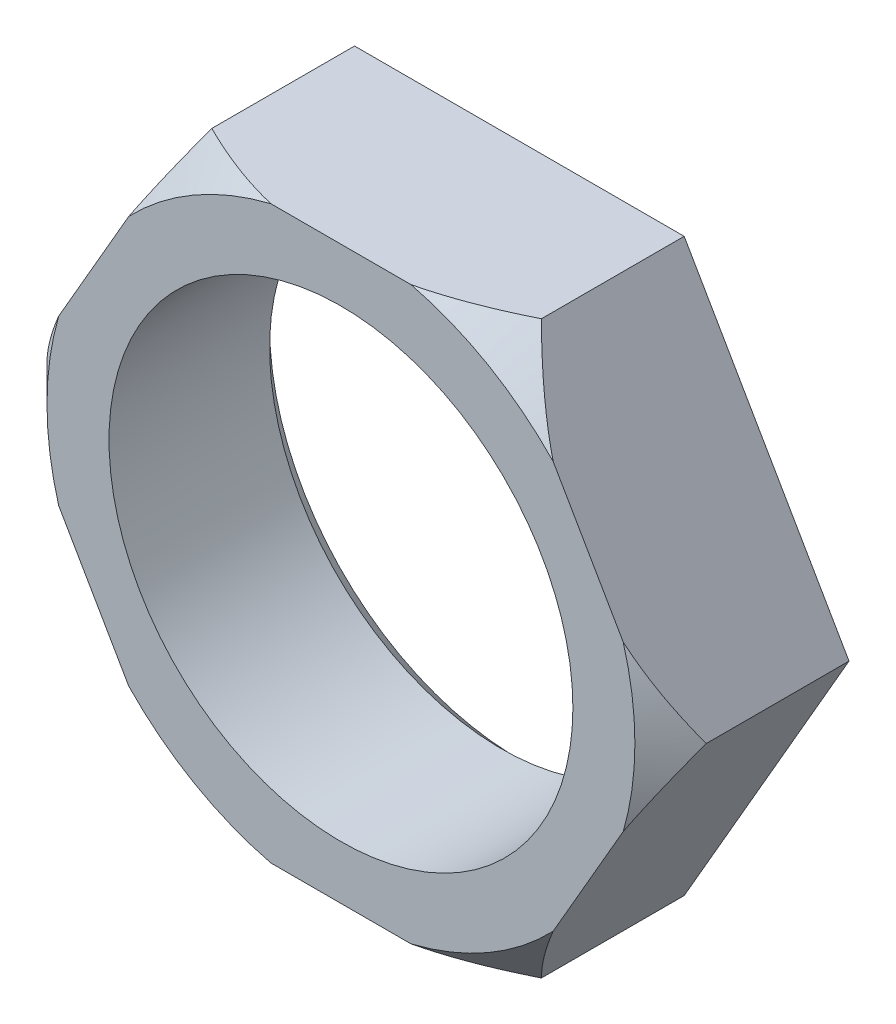
ISO-10303-21;
HEADER;
FILE_DESCRIPTION(('STEP AP214'),'2;1');
FILE_NAME('part.step','',(''),(''),'','','');
FILE_SCHEMA(('AUTOMOTIVE_DESIGN { 1 0 10303 214 1 1 1 1 }'));
ENDSEC;
DATA;
#1=APPLICATION_CONTEXT('core data for automotive mechanical design processes');
#2=APPLICATION_PROTOCOL_DEFINITION('international standard','automotive_design',2000,#1);
#3=PRODUCT_CONTEXT('',#1,'mechanical');
#4=PRODUCT('Part','Part','',(#3));
#5=PRODUCT_RELATED_PRODUCT_CATEGORY('part','',(#4));
#6=PRODUCT_DEFINITION_FORMATION('','',#4);
#7=PRODUCT_DEFINITION_CONTEXT('part definition',#1,'design');
#8=PRODUCT_DEFINITION('design','',#6,#7);
#9=PRODUCT_DEFINITION_SHAPE('','',#8);
#10=(LENGTH_UNIT() NAMED_UNIT(*) SI_UNIT(.MILLI.,.METRE.));
#11=(NAMED_UNIT(*) PLANE_ANGLE_UNIT() SI_UNIT($,.RADIAN.));
#12=(NAMED_UNIT(*) SI_UNIT($,.STERADIAN.) SOLID_ANGLE_UNIT());
#13=UNCERTAINTY_MEASURE_WITH_UNIT(LENGTH_MEASURE(1.E-05),#10,'distance_accuracy_value','');
#14=(GEOMETRIC_REPRESENTATION_CONTEXT(3) GLOBAL_UNCERTAINTY_ASSIGNED_CONTEXT((#13)) GLOBAL_UNIT_ASSIGNED_CONTEXT((#10,
#11,#12)) REPRESENTATION_CONTEXT('',''));
#15=CARTESIAN_POINT('',(0.,0.,0.));
#16=DIRECTION('',(0.,0.,1.));
#17=DIRECTION('',(1.,0.,0.));
#18=AXIS2_PLACEMENT_3D('',#15,#16,#17);
#19=CARTESIAN_POINT('',(0.,0.,5.));
#20=DIRECTION('',(0.,0.,1.));
#21=DIRECTION('',(1.,0.,0.));
#22=AXIS2_PLACEMENT_3D('',#19,#20,#21);
#23=PLANE('',#22);
#24=CARTESIAN_POINT('',(0.,0.,5.));
#25=DIRECTION('',(0.,0.,1.));
#26=DIRECTION('',(1.,0.,0.));
#27=AXIS2_PLACEMENT_3D('',#24,#25,#26);
#28=CIRCLE('',#27,6.5);
#29=CARTESIAN_POINT('',(6.5,0.,5.));
#30=VERTEX_POINT('',#29);
#31=EDGE_CURVE('E180',#30,#30,#28,.T.);
#32=ORIENTED_EDGE('',*,*,#31,.F.);
#33=EDGE_LOOP('',(#32));
#34=FACE_BOUND('',#33,.T.);
#35=DIRECTION('',(-0.5,0.866025403784438,0.));
#36=VECTOR('',#35,1.);
#37=CARTESIAN_POINT('',(9.23760430703402,0.,5.));
#38=LINE('',#37,#36);
#39=CARTESIAN_POINT('',(7.91030871331505,2.29894340498354,5.));
#40=VERTEX_POINT('',#39);
#41=CARTESIAN_POINT('',(5.94609774723597,5.70105659501646,5.));
#42=VERTEX_POINT('',#41);
#43=EDGE_CURVE('E169',#40,#42,#38,.T.);
#44=ORIENTED_EDGE('',*,*,#43,.T.);
#45=CARTESIAN_POINT('',(0.,0.,5.));
#46=DIRECTION('',(0.,0.,-1.));
#47=DIRECTION('',(-1.,0.,0.));
#48=AXIS2_PLACEMENT_3D('',#45,#46,#47);
#49=CIRCLE('',#48,8.23760430703402);
#50=CARTESIAN_POINT('',(1.9642109660791,8.,5.));
#51=VERTEX_POINT('',#50);
#52=EDGE_CURVE('E303',#51,#42,#49,.T.);
#53=ORIENTED_EDGE('',*,*,#52,.F.);
#54=DIRECTION('',(-1.,0.,0.));
#55=VECTOR('',#54,1.);
#56=CARTESIAN_POINT('',(4.618802153517,8.,5.));
#57=LINE('',#56,#55);
#58=CARTESIAN_POINT('',(-1.9642109660791,8.,5.));
#59=VERTEX_POINT('',#58);
#60=EDGE_CURVE('E165',#51,#59,#57,.T.);
#61=ORIENTED_EDGE('',*,*,#60,.T.);
#62=CARTESIAN_POINT('',(-5.94609774723597,5.70105659501647,4.99999999999999));
#63=VERTEX_POINT('',#62);
#64=EDGE_CURVE('E150',#63,#59,#49,.T.);
#65=ORIENTED_EDGE('',*,*,#64,.F.);
#66=DIRECTION('',(-0.5,-0.866025403784439,0.));
#67=VECTOR('',#66,1.);
#68=CARTESIAN_POINT('',(-4.61880215351701,8.,5.));
#69=LINE('',#68,#67);
#70=CARTESIAN_POINT('',(-7.91030871331506,2.29894340498353,4.99999999999999));
#71=VERTEX_POINT('',#70);
#72=EDGE_CURVE('E156',#63,#71,#69,.T.);
#73=ORIENTED_EDGE('',*,*,#72,.T.);
#74=CARTESIAN_POINT('',(-7.91030871331506,-2.29894340498353,4.99999999999999));
#75=VERTEX_POINT('',#74);
#76=EDGE_CURVE('E138',#75,#71,#49,.T.);
#77=ORIENTED_EDGE('',*,*,#76,.F.);
#78=DIRECTION('',(0.5,-0.866025403784439,0.));
#79=VECTOR('',#78,1.);
#80=CARTESIAN_POINT('',(-9.23760430703402,0.,5.));
#81=LINE('',#80,#79);
#82=CARTESIAN_POINT('',(-5.94609774723596,-5.70105659501648,4.99999999999999));
#83=VERTEX_POINT('',#82);
#84=EDGE_CURVE('E164',#75,#83,#81,.T.);
#85=ORIENTED_EDGE('',*,*,#84,.T.);
#86=CARTESIAN_POINT('',(-1.9642109660791,-8.,5.));
#87=VERTEX_POINT('',#86);
#88=EDGE_CURVE('E148',#87,#83,#49,.T.);
#89=ORIENTED_EDGE('',*,*,#88,.F.);
#90=DIRECTION('',(1.,0.,0.));
#91=VECTOR('',#90,1.);
#92=CARTESIAN_POINT('',(-4.61880215351701,-8.,5.));
#93=LINE('',#92,#91);
#94=CARTESIAN_POINT('',(1.96421096607908,-8.,5.));
#95=VERTEX_POINT('',#94);
#96=EDGE_CURVE('E167',#87,#95,#93,.T.);
#97=ORIENTED_EDGE('',*,*,#96,.T.);
#98=CARTESIAN_POINT('',(5.94609774723597,-5.70105659501646,5.));
#99=VERTEX_POINT('',#98);
#100=EDGE_CURVE('E333',#99,#95,#49,.T.);
#101=ORIENTED_EDGE('',*,*,#100,.F.);
#102=DIRECTION('',(0.5,0.866025403784439,0.));
#103=VECTOR('',#102,1.);
#104=CARTESIAN_POINT('',(4.61880215351701,-8.,5.));
#105=LINE('',#104,#103);
#106=CARTESIAN_POINT('',(7.91030871331505,-2.29894340498354,5.));
#107=VERTEX_POINT('',#106);
#108=EDGE_CURVE('E194',#99,#107,#105,.T.);
#109=ORIENTED_EDGE('',*,*,#108,.T.);
#110=EDGE_CURVE('E305',#40,#107,#49,.T.);
#111=ORIENTED_EDGE('',*,*,#110,.F.);
#112=EDGE_LOOP('',(#44,#53,#61,#65,#73,#77,#85,#89,#97,#101,#109,#111));
#113=FACE_BOUND('',#112,.T.);
#114=ADVANCED_FACE('F49',(#34,#113),#23,.T.);
#115=CARTESIAN_POINT('',(4.61880215351701,-8.,5.));
#116=DIRECTION('',(-0.866025403784439,0.5,0.));
#117=DIRECTION('',(-0.5,-0.866025403784439,0.));
#118=AXIS2_PLACEMENT_3D('',#115,#116,#117);
#119=PLANE('',#118);
#120=CARTESIAN_POINT('',(4.61839800832857,-8.0007,3.9995958282907));
#121=CARTESIAN_POINT('',(4.69782286430401,-7.86313211406671,4.07901918181854));
#122=CARTESIAN_POINT('',(4.77785825491992,-7.72450675111634,4.1560054071897));
#123=CARTESIAN_POINT('',(4.93926992045058,-7.44493354548292,4.30436213535415));
#124=CARTESIAN_POINT('',(5.0206468989046,-7.30398448423411,4.37572957048532));
#125=CARTESIAN_POINT('',(5.26772621714585,-6.87603055154078,4.58090030598886));
#126=CARTESIAN_POINT('',(5.4355204279216,-6.58540245326127,4.70489649185222));
#127=CARTESIAN_POINT('',(5.77389105134235,-5.99932734170777,4.91723258665979));
#128=CARTESIAN_POINT('',(5.94438094347211,-5.70403018636209,5.0061075492822));
#129=CARTESIAN_POINT('',(6.2029192460461,-5.25622871060133,5.10891492448876));
#130=CARTESIAN_POINT('',(6.28947937833778,-5.10630216356224,5.13808611718849));
#131=CARTESIAN_POINT('',(6.46333271999396,-4.80517934274812,5.18559990423727));
#132=CARTESIAN_POINT('',(6.5506258177712,-4.65398326224785,5.20394411763072));
#133=CARTESIAN_POINT('',(6.76333420874638,-4.28556152188262,5.2346994393306));
#134=CARTESIAN_POINT('',(6.8889786631582,-4.06793894315208,5.24115403201832));
#135=CARTESIAN_POINT('',(7.14004125523187,-3.63308577780053,5.23033059090234));
#136=CARTESIAN_POINT('',(7.26545929811714,-3.41585535533741,5.21304423672713));
#137=CARTESIAN_POINT('',(7.51511311464681,-2.98344226080454,5.15575786712185));
#138=CARTESIAN_POINT('',(7.63934740728517,-2.76826215391251,5.11573244120219));
#139=CARTESIAN_POINT('',(7.88568076089192,-2.3416002698668,5.01514401708641));
#140=CARTESIAN_POINT('',(8.00777998478796,-2.13011821051412,4.95458259325327));
#141=CARTESIAN_POINT('',(8.22455299532494,-1.75465634255442,4.82997392329796));
#142=CARTESIAN_POINT('',(8.31970629502342,-1.58984599296882,4.76920070424597));
#143=CARTESIAN_POINT('',(8.50830433629054,-1.26318460328621,4.63785846738779));
#144=CARTESIAN_POINT('',(8.60174902543571,-1.10133365398928,4.56728914958733));
#145=CARTESIAN_POINT('',(8.7866355717818,-0.781100762081904,4.41793724064377));
#146=CARTESIAN_POINT('',(8.87808268778483,-0.622709710959015,4.33918047381096));
#147=CARTESIAN_POINT('',(9.0592831083441,-0.308861376197516,4.17448822158527));
#148=CARTESIAN_POINT('',(9.14903741198672,-0.153402362090536,4.08855714400516));
#149=CARTESIAN_POINT('',(9.23800845222245,0.000699999999999628,3.9995958282907));
#150=B_SPLINE_CURVE_WITH_KNOTS('',3,(#120,#121,#122,#123,#124,#125,#126,#127,#128,#129,#130,
#131,#132,#133,#134,#135,#136,#137,#138,#139,#140,#141,#142,#143,#144,#145,#146,#147,#148,#149),
.UNSPECIFIED.,.F.,.F.,(4,2,2,2,2,2,2,2,2,2,2,2,2,2,4),(0.,0.532764942298107,1.06581876702747,
2.13768333961069,3.19252330094283,3.71890840723074,4.24521477900717,4.99815844168652,
5.75136605213299,6.5054170183609,7.25941018941171,7.85845333924238,8.45751483813045,
9.05474106693446,9.65160302968535),.UNSPECIFIED.);
#151=CARTESIAN_POINT('',(4.61880215351701,-8.,4.));
#152=VERTEX_POINT('',#151);
#153=EDGE_CURVE('E231',#152,#99,#150,.T.);
#154=ORIENTED_EDGE('',*,*,#153,.F.);
#155=DIRECTION('',(0.,0.,-1.));
#156=VECTOR('',#155,1.);
#157=CARTESIAN_POINT('',(4.61880215351701,-8.,5.));
#158=LINE('',#157,#156);
#159=CARTESIAN_POINT('',(4.61880215351701,-8.,0.));
#160=VERTEX_POINT('',#159);
#161=EDGE_CURVE('E175',#152,#160,#158,.T.);
#162=ORIENTED_EDGE('',*,*,#161,.T.);
#163=DIRECTION('',(0.5,0.866025403784439,0.));
#164=VECTOR('',#163,1.);
#165=CARTESIAN_POINT('',(4.61880215351701,-8.,0.));
#166=LINE('',#165,#164);
#167=CARTESIAN_POINT('',(9.23760430703402,0.,0.));
#168=VERTEX_POINT('',#167);
#169=EDGE_CURVE('E176',#160,#168,#166,.T.);
#170=ORIENTED_EDGE('',*,*,#169,.T.);
#171=DIRECTION('',(0.,0.,-1.));
#172=VECTOR('',#171,1.);
#173=CARTESIAN_POINT('',(9.23760430703402,0.,5.));
#174=LINE('',#173,#172);
#175=CARTESIAN_POINT('',(9.23760430703402,0.,4.));
#176=VERTEX_POINT('',#175);
#177=EDGE_CURVE('E203',#176,#168,#174,.T.);
#178=ORIENTED_EDGE('',*,*,#177,.F.);
#179=EDGE_CURVE('E65',#107,#176,#150,.T.);
#180=ORIENTED_EDGE('',*,*,#179,.F.);
#181=ORIENTED_EDGE('',*,*,#108,.F.);
#182=EDGE_LOOP('',(#154,#162,#170,#178,#180,#181));
#183=FACE_BOUND('',#182,.T.);
#184=ADVANCED_FACE('F270',(#183),#119,.F.);
#185=CARTESIAN_POINT('',(9.23760430703402,0.,5.));
#186=DIRECTION('',(-0.866025403784438,-0.5,0.));
#187=DIRECTION('',(0.5,-0.866025403784439,0.));
#188=AXIS2_PLACEMENT_3D('',#185,#186,#187);
#189=PLANE('',#188);
#190=CARTESIAN_POINT('',(9.23800845222245,-0.000700000000000923,3.9995958282907));
#191=CARTESIAN_POINT('',(9.15858359624701,0.13686788593329,4.07901918181854));
#192=CARTESIAN_POINT('',(9.0785482056311,0.275493248883665,4.1560054071897));
#193=CARTESIAN_POINT('',(8.91713654010044,0.555066454517086,4.30436213535415));
#194=CARTESIAN_POINT('',(8.83575956164642,0.696015515765892,4.37572957048533));
#195=CARTESIAN_POINT('',(8.58868024340516,1.12396944845923,4.58090030598886));
#196=CARTESIAN_POINT('',(8.42088603262942,1.41459754673873,4.70489649185222));
#197=CARTESIAN_POINT('',(8.08251540920867,2.00067265829223,4.91723258665979));
#198=CARTESIAN_POINT('',(7.91202551707891,2.29596981363791,5.0061075492822));
#199=CARTESIAN_POINT('',(7.65348721450492,2.74377128939868,5.10891492448876));
#200=CARTESIAN_POINT('',(7.56692708221324,2.89369783643776,5.13808611718849));
#201=CARTESIAN_POINT('',(7.39307374055706,3.19482065725189,5.18559990423727));
#202=CARTESIAN_POINT('',(7.30578064277981,3.34601673775215,5.20394411763072));
#203=CARTESIAN_POINT('',(7.09307225180464,3.71443847811738,5.23469943933061));
#204=CARTESIAN_POINT('',(6.96742779739282,3.93206105684792,5.24115403201832));
#205=CARTESIAN_POINT('',(6.71636520531914,4.36691422219947,5.23033059090234));
#206=CARTESIAN_POINT('',(6.59094716243388,4.58414464466259,5.21304423672713));
#207=CARTESIAN_POINT('',(6.34129334590421,5.01655773919547,5.15575786712185));
#208=CARTESIAN_POINT('',(6.21705905326585,5.23173784608749,5.11573244120219));
#209=CARTESIAN_POINT('',(5.9707256996591,5.6583997301332,5.01514401708641));
#210=CARTESIAN_POINT('',(5.84862647576306,5.86988178948588,4.95458259325327));
#211=CARTESIAN_POINT('',(5.63185346522608,6.24534365744559,4.82997392329797));
#212=CARTESIAN_POINT('',(5.5367001655276,6.41015400703118,4.76920070424597));
#213=CARTESIAN_POINT('',(5.34810212426048,6.7368153967138,4.63785846738779));
#214=CARTESIAN_POINT('',(5.25465743511531,6.89866634601073,4.56728914958733));
#215=CARTESIAN_POINT('',(5.06977088876921,7.2188992379181,4.41793724064377));
#216=CARTESIAN_POINT('',(4.97832377276618,7.37729028904099,4.33918047381096));
#217=CARTESIAN_POINT('',(4.79712335220692,7.69113862380249,4.17448822158527));
#218=CARTESIAN_POINT('',(4.7073690485643,7.84659763790947,4.08855714400516));
#219=CARTESIAN_POINT('',(4.61839800832857,8.0007,3.9995958282907));
#220=B_SPLINE_CURVE_WITH_KNOTS('',3,(#190,#191,#192,#193,#194,#195,#196,#197,#198,#199,#200,
#201,#202,#203,#204,#205,#206,#207,#208,#209,#210,#211,#212,#213,#214,#215,#216,#217,#218,#219),
.UNSPECIFIED.,.F.,.F.,(4,2,2,2,2,2,2,2,2,2,2,2,2,2,4),(0.,0.532764942298108,1.06581876702747,
2.13768333961069,3.19252330094283,3.71890840723075,4.24521477900718,4.99815844168652,
5.75136605213299,6.5054170183609,7.25941018941171,7.85845333924239,8.45751483813045,
9.05474106693447,9.65160302968535),.UNSPECIFIED.);
#221=EDGE_CURVE('E300',#176,#40,#220,.T.);
#222=ORIENTED_EDGE('',*,*,#221,.F.);
#223=ORIENTED_EDGE('',*,*,#177,.T.);
#224=DIRECTION('',(-0.5,0.866025403784438,0.));
#225=VECTOR('',#224,1.);
#226=CARTESIAN_POINT('',(9.23760430703402,0.,0.));
#227=LINE('',#226,#225);
#228=CARTESIAN_POINT('',(4.618802153517,8.,0.));
#229=VERTEX_POINT('',#228);
#230=EDGE_CURVE('E179',#168,#229,#227,.T.);
#231=ORIENTED_EDGE('',*,*,#230,.T.);
#232=DIRECTION('',(0.,0.,-1.));
#233=VECTOR('',#232,1.);
#234=CARTESIAN_POINT('',(4.618802153517,8.,5.));
#235=LINE('',#234,#233);
#236=CARTESIAN_POINT('',(4.618802153517,8.,4.));
#237=VERTEX_POINT('',#236);
#238=EDGE_CURVE('E201',#237,#229,#235,.T.);
#239=ORIENTED_EDGE('',*,*,#238,.F.);
#240=EDGE_CURVE('E73',#42,#237,#220,.T.);
#241=ORIENTED_EDGE('',*,*,#240,.F.);
#242=ORIENTED_EDGE('',*,*,#43,.F.);
#243=EDGE_LOOP('',(#222,#223,#231,#239,#241,#242));
#244=FACE_BOUND('',#243,.T.);
#245=ADVANCED_FACE('F265',(#244),#189,.F.);
#246=CARTESIAN_POINT('',(4.618802153517,8.,5.));
#247=DIRECTION('',(0.,-1.,0.));
#248=DIRECTION('',(1.,0.,0.));
#249=AXIS2_PLACEMENT_3D('',#246,#247,#248);
#250=PLANE('',#249);
#251=CARTESIAN_POINT('',(4.619502153517,8.,3.99964998010923));
#252=CARTESIAN_POINT('',(4.46065570669661,8.,4.07907030559787));
#253=CARTESIAN_POINT('',(4.30058823163339,8.,4.15605354141029));
#254=CARTESIAN_POINT('',(3.97777161908812,8.,4.30440440100949));
#255=CARTESIAN_POINT('',(3.81502107464018,8.,4.37576895732237));
#256=CARTESIAN_POINT('',(3.32087302017574,8.,4.5809311998118));
#257=CARTESIAN_POINT('',(2.98529195461351,8.,4.70492201151897));
#258=CARTESIAN_POINT('',(2.30856561916667,8.,4.91724865310787));
#259=CARTESIAN_POINT('',(1.96759337103815,8.,5.00611948959363));
#260=CARTESIAN_POINT('',(1.45052843366235,8.,5.1089219042627));
#261=CARTESIAN_POINT('',(1.27741210163092,8.,5.13809165010705));
#262=CARTESIAN_POINT('',(0.929713387741251,8.,5.1856030125946));
#263=CARTESIAN_POINT('',(0.755131229019291,8.,5.20394624805151));
#264=CARTESIAN_POINT('',(0.329718802326874,8.,5.23470022439008));
#265=CARTESIAN_POINT('',(0.0784302067264087,8.,5.24115420644072));
#266=CARTESIAN_POINT('',(-0.423694292624965,8.,5.2303296146134));
#267=CARTESIAN_POINT('',(-0.67453000680891,8.,5.2130427206398));
#268=CARTESIAN_POINT('',(-1.17383683568339,8.,5.15575537376395));
#269=CARTESIAN_POINT('',(-1.42230498856228,8.,5.11572951256641));
#270=CARTESIAN_POINT('',(-1.91497081608896,8.,5.01514033230961));
#271=CARTESIAN_POINT('',(-2.15916881661257,8.,4.95457858769855));
#272=CARTESIAN_POINT('',(-2.59270336317659,8.,4.8299725081333));
#273=CARTESIAN_POINT('',(-2.78299911845453,8.,4.76920280270799));
#274=CARTESIAN_POINT('',(-3.16017389739909,8.,4.63786866945562));
#275=CARTESIAN_POINT('',(-3.34705281644912,8.,4.56730394229134));
#276=CARTESIAN_POINT('',(-3.71680538917561,8.,4.41796205586996));
#277=CARTESIAN_POINT('',(-3.89968955964784,8.,4.33921071925262));
#278=CARTESIAN_POINT('',(-4.26207066263286,8.,4.17452997647546));
#279=CARTESIAN_POINT('',(-4.44156959260544,8.,4.08860497662258));
#280=CARTESIAN_POINT('',(-4.61950215351701,8.,3.99964998010923));
#281=B_SPLINE_CURVE_WITH_KNOTS('',3,(#251,#252,#253,#254,#255,#256,#257,#258,#259,#260,#261,
#262,#263,#264,#265,#266,#267,#268,#269,#270,#271,#272,#273,#274,#275,#276,#277,#278,#279,#280),
.UNSPECIFIED.,.F.,.F.,(4,2,2,2,2,2,2,2,2,2,2,2,2,2,4),(0.,0.532752118889545,1.06579310134962,
2.13763143629609,3.19244651823443,3.71881928824702,4.24511333340349,4.99805601052093,
5.75126262709641,6.50531252927909,7.25930463291703,7.85831363910881,8.45734095513026,
9.0545330399735,9.65136097054877),.UNSPECIFIED.);
#282=EDGE_CURVE('E255',#237,#51,#281,.T.);
#283=ORIENTED_EDGE('',*,*,#282,.F.);
#284=ORIENTED_EDGE('',*,*,#238,.T.);
#285=DIRECTION('',(-1.,0.,0.));
#286=VECTOR('',#285,1.);
#287=CARTESIAN_POINT('',(4.618802153517,8.,0.));
#288=LINE('',#287,#286);
#289=CARTESIAN_POINT('',(-4.61880215351701,8.,0.));
#290=VERTEX_POINT('',#289);
#291=EDGE_CURVE('E183',#229,#290,#288,.T.);
#292=ORIENTED_EDGE('',*,*,#291,.T.);
#293=DIRECTION('',(0.,0.,-1.));
#294=VECTOR('',#293,1.);
#295=CARTESIAN_POINT('',(-4.61880215351701,8.,5.));
#296=LINE('',#295,#294);
#297=CARTESIAN_POINT('',(-4.61880215351701,8.,4.));
#298=VERTEX_POINT('',#297);
#299=EDGE_CURVE('E199',#298,#290,#296,.T.);
#300=ORIENTED_EDGE('',*,*,#299,.F.);
#301=EDGE_CURVE('E249',#59,#298,#281,.T.);
#302=ORIENTED_EDGE('',*,*,#301,.F.);
#303=ORIENTED_EDGE('',*,*,#60,.F.);
#304=EDGE_LOOP('',(#283,#284,#292,#300,#302,#303));
#305=FACE_BOUND('',#304,.T.);
#306=ADVANCED_FACE('F262',(#305),#250,.F.);
#307=CARTESIAN_POINT('',(-4.61880215351701,8.,5.));
#308=DIRECTION('',(0.866025403784439,-0.5,0.));
#309=DIRECTION('',(0.5,0.866025403784439,0.));
#310=AXIS2_PLACEMENT_3D('',#307,#308,#309);
#311=PLANE('',#310);
#312=CARTESIAN_POINT('',(-4.61839800832857,8.0007,3.9995958282907));
#313=CARTESIAN_POINT('',(-4.69782286430401,7.86313211406671,4.07901918181854));
#314=CARTESIAN_POINT('',(-4.77785825491992,7.72450675111634,4.1560054071897));
#315=CARTESIAN_POINT('',(-4.93926992045058,7.44493354548291,4.30436213535415));
#316=CARTESIAN_POINT('',(-5.0206468989046,7.30398448423411,4.37572957048532));
#317=CARTESIAN_POINT('',(-5.26772621714586,6.87603055154077,4.58090030598886));
#318=CARTESIAN_POINT('',(-5.4355204279216,6.58540245326127,4.70489649185222));
#319=CARTESIAN_POINT('',(-5.77389105134235,5.99932734170777,4.91723258665979));
#320=CARTESIAN_POINT('',(-5.94438094347211,5.70403018636209,5.0061075492822));
#321=CARTESIAN_POINT('',(-6.2029192460461,5.25622871060132,5.10891492448876));
#322=CARTESIAN_POINT('',(-6.28947937833779,5.10630216356224,5.13808611718849));
#323=CARTESIAN_POINT('',(-6.46333271999396,4.80517934274811,5.18559990423727));
#324=CARTESIAN_POINT('',(-6.55062581777121,4.65398326224785,5.20394411763072));
#325=CARTESIAN_POINT('',(-6.76333420874638,4.28556152188262,5.2346994393306));
#326=CARTESIAN_POINT('',(-6.8889786631582,4.06793894315208,5.24115403201832));
#327=CARTESIAN_POINT('',(-7.14004125523188,3.63308577780053,5.23033059090234));
#328=CARTESIAN_POINT('',(-7.26545929811714,3.41585535533741,5.21304423672713));
#329=CARTESIAN_POINT('',(-7.51511311464681,2.98344226080453,5.15575786712185));
#330=CARTESIAN_POINT('',(-7.63934740728517,2.76826215391251,5.11573244120218));
#331=CARTESIAN_POINT('',(-7.88568076089192,2.3416002698668,5.0151440170864));
#332=CARTESIAN_POINT('',(-8.00777998478796,2.13011821051412,4.95458259325327));
#333=CARTESIAN_POINT('',(-8.22455299532494,1.75465634255442,4.82997392329796));
#334=CARTESIAN_POINT('',(-8.31970629502342,1.58984599296882,4.76920070424597));
#335=CARTESIAN_POINT('',(-8.50830433629053,1.2631846032862,4.63785846738778));
#336=CARTESIAN_POINT('',(-8.60174902543571,1.10133365398927,4.56728914958732));
#337=CARTESIAN_POINT('',(-8.7866355717818,0.781100762081904,4.41793724064377));
#338=CARTESIAN_POINT('',(-8.87808268778483,0.622709710959015,4.33918047381096));
#339=CARTESIAN_POINT('',(-9.0592831083441,0.308861376197516,4.17448822158527));
#340=CARTESIAN_POINT('',(-9.14903741198672,0.153402362090536,4.08855714400516));
#341=CARTESIAN_POINT('',(-9.23800845222245,-0.000700000000000918,3.9995958282907));
#342=B_SPLINE_CURVE_WITH_KNOTS('',3,(#312,#313,#314,#315,#316,#317,#318,#319,#320,#321,#322,
#323,#324,#325,#326,#327,#328,#329,#330,#331,#332,#333,#334,#335,#336,#337,#338,#339,#340,#341),
.UNSPECIFIED.,.F.,.F.,(4,2,2,2,2,2,2,2,2,2,2,2,2,2,4),(0.,0.532764942298108,1.06581876702747,
2.13768333961069,3.19252330094283,3.71890840723074,4.24521477900718,4.99815844168652,
5.75136605213299,6.5054170183609,7.25941018941171,7.85845333924238,8.45751483813045,
9.05474106693446,9.65160302968534),.UNSPECIFIED.);
#343=EDGE_CURVE('E159',#298,#63,#342,.T.);
#344=ORIENTED_EDGE('',*,*,#343,.F.);
#345=ORIENTED_EDGE('',*,*,#299,.T.);
#346=DIRECTION('',(-0.5,-0.866025403784439,0.));
#347=VECTOR('',#346,1.);
#348=CARTESIAN_POINT('',(-4.61880215351701,8.,0.));
#349=LINE('',#348,#347);
#350=CARTESIAN_POINT('',(-9.23760430703402,0.,0.));
#351=VERTEX_POINT('',#350);
#352=EDGE_CURVE('E186',#290,#351,#349,.T.);
#353=ORIENTED_EDGE('',*,*,#352,.T.);
#354=DIRECTION('',(0.,0.,-1.));
#355=VECTOR('',#354,1.);
#356=CARTESIAN_POINT('',(-9.23760430703402,0.,5.));
#357=LINE('',#356,#355);
#358=CARTESIAN_POINT('',(-9.23760430703402,0.,4.));
#359=VERTEX_POINT('',#358);
#360=EDGE_CURVE('E158',#359,#351,#357,.T.);
#361=ORIENTED_EDGE('',*,*,#360,.F.);
#362=EDGE_CURVE('E141',#71,#359,#342,.T.);
#363=ORIENTED_EDGE('',*,*,#362,.F.);
#364=ORIENTED_EDGE('',*,*,#72,.F.);
#365=EDGE_LOOP('',(#344,#345,#353,#361,#363,#364));
#366=FACE_BOUND('',#365,.T.);
#367=ADVANCED_FACE('F155',(#366),#311,.F.);
#368=CARTESIAN_POINT('',(-9.23760430703402,0.,5.));
#369=DIRECTION('',(0.866025403784438,0.5,0.));
#370=DIRECTION('',(-0.5,0.866025403784439,0.));
#371=AXIS2_PLACEMENT_3D('',#368,#369,#370);
#372=PLANE('',#371);
#373=CARTESIAN_POINT('',(-9.23800845222245,0.000699999999999229,3.9995958282907));
#374=CARTESIAN_POINT('',(-9.15858359624701,-0.136867885933291,4.07901918181854));
#375=CARTESIAN_POINT('',(-9.0785482056311,-0.275493248883666,4.1560054071897));
#376=CARTESIAN_POINT('',(-8.91713654010044,-0.555066454517088,4.30436213535415));
#377=CARTESIAN_POINT('',(-8.83575956164642,-0.696015515765894,4.37572957048532));
#378=CARTESIAN_POINT('',(-8.58868024340516,-1.12396944845923,4.58090030598886));
#379=CARTESIAN_POINT('',(-8.42088603262942,-1.41459754673873,4.70489649185222));
#380=CARTESIAN_POINT('',(-8.08251540920867,-2.00067265829223,4.91723258665979));
#381=CARTESIAN_POINT('',(-7.91202551707891,-2.29596981363791,5.0061075492822));
#382=CARTESIAN_POINT('',(-7.65348721450492,-2.74377128939868,5.10891492448876));
#383=CARTESIAN_POINT('',(-7.56692708221324,-2.89369783643776,5.13808611718849));
#384=CARTESIAN_POINT('',(-7.39307374055706,-3.19482065725189,5.18559990423727));
#385=CARTESIAN_POINT('',(-7.30578064277981,-3.34601673775215,5.20394411763072));
#386=CARTESIAN_POINT('',(-7.09307225180464,-3.71443847811738,5.2346994393306));
#387=CARTESIAN_POINT('',(-6.96742779739282,-3.93206105684792,5.24115403201832));
#388=CARTESIAN_POINT('',(-6.71636520531914,-4.36691422219947,5.23033059090234));
#389=CARTESIAN_POINT('',(-6.59094716243388,-4.58414464466259,5.21304423672713));
#390=CARTESIAN_POINT('',(-6.34129334590421,-5.01655773919547,5.15575786712185));
#391=CARTESIAN_POINT('',(-6.21705905326585,-5.23173784608749,5.11573244120218));
#392=CARTESIAN_POINT('',(-5.9707256996591,-5.6583997301332,5.0151440170864));
#393=CARTESIAN_POINT('',(-5.84862647576306,-5.86988178948588,4.95458259325327));
#394=CARTESIAN_POINT('',(-5.63185346522608,-6.24534365744559,4.82997392329796));
#395=CARTESIAN_POINT('',(-5.5367001655276,-6.41015400703118,4.76920070424597));
#396=CARTESIAN_POINT('',(-5.34810212426049,-6.7368153967138,4.63785846738778));
#397=CARTESIAN_POINT('',(-5.25465743511531,-6.89866634601073,4.56728914958732));
#398=CARTESIAN_POINT('',(-5.06977088876921,-7.2188992379181,4.41793724064377));
#399=CARTESIAN_POINT('',(-4.97832377276619,-7.37729028904099,4.33918047381096));
#400=CARTESIAN_POINT('',(-4.79712335220692,-7.69113862380249,4.17448822158527));
#401=CARTESIAN_POINT('',(-4.7073690485643,-7.84659763790947,4.08855714400516));
#402=CARTESIAN_POINT('',(-4.61839800832857,-8.0007,3.9995958282907));
#403=B_SPLINE_CURVE_WITH_KNOTS('',3,(#373,#374,#375,#376,#377,#378,#379,#380,#381,#382,#383,
#384,#385,#386,#387,#388,#389,#390,#391,#392,#393,#394,#395,#396,#397,#398,#399,#400,#401,#402),
.UNSPECIFIED.,.F.,.F.,(4,2,2,2,2,2,2,2,2,2,2,2,2,2,4),(0.,0.532764942298108,1.06581876702747,
2.13768333961069,3.19252330094283,3.71890840723074,4.24521477900718,4.99815844168652,
5.75136605213299,6.5054170183609,7.25941018941171,7.85845333924238,8.45751483813045,
9.05474106693446,9.65160302968535),.UNSPECIFIED.);
#404=EDGE_CURVE('E143',#359,#75,#403,.T.);
#405=ORIENTED_EDGE('',*,*,#404,.F.);
#406=ORIENTED_EDGE('',*,*,#360,.T.);
#407=DIRECTION('',(0.5,-0.866025403784439,0.));
#408=VECTOR('',#407,1.);
#409=CARTESIAN_POINT('',(-9.23760430703402,0.,0.));
#410=LINE('',#409,#408);
#411=CARTESIAN_POINT('',(-4.61880215351701,-8.,0.));
#412=VERTEX_POINT('',#411);
#413=EDGE_CURVE('E188',#351,#412,#410,.T.);
#414=ORIENTED_EDGE('',*,*,#413,.T.);
#415=DIRECTION('',(0.,0.,-1.));
#416=VECTOR('',#415,1.);
#417=CARTESIAN_POINT('',(-4.61880215351701,-8.,5.));
#418=LINE('',#417,#416);
#419=CARTESIAN_POINT('',(-4.61880215351701,-8.,4.));
#420=VERTEX_POINT('',#419);
#421=EDGE_CURVE('E196',#420,#412,#418,.T.);
#422=ORIENTED_EDGE('',*,*,#421,.F.);
#423=EDGE_CURVE('E238',#83,#420,#403,.T.);
#424=ORIENTED_EDGE('',*,*,#423,.F.);
#425=ORIENTED_EDGE('',*,*,#84,.F.);
#426=EDGE_LOOP('',(#405,#406,#414,#422,#424,#425));
#427=FACE_BOUND('',#426,.T.);
#428=ADVANCED_FACE('F312',(#427),#372,.F.);
#429=CARTESIAN_POINT('',(-4.61880215351701,-8.,5.));
#430=DIRECTION('',(0.,1.,0.));
#431=DIRECTION('',(0.,0.,1.));
#432=AXIS2_PLACEMENT_3D('',#429,#430,#431);
#433=PLANE('',#432);
#434=CARTESIAN_POINT('',(-4.61950215351701,-8.,3.99964998010923));
#435=CARTESIAN_POINT('',(-4.46065570669661,-8.,4.07907030559787));
#436=CARTESIAN_POINT('',(-4.30058823163339,-8.,4.15605354141029));
#437=CARTESIAN_POINT('',(-3.97777161908812,-8.,4.30440440100948));
#438=CARTESIAN_POINT('',(-3.81502107464019,-8.,4.37576895732236));
#439=CARTESIAN_POINT('',(-3.32087302017574,-8.,4.5809311998118));
#440=CARTESIAN_POINT('',(-2.98529195461351,-8.,4.70492201151897));
#441=CARTESIAN_POINT('',(-2.30856561916667,-8.,4.91724865310787));
#442=CARTESIAN_POINT('',(-1.96759337103816,-8.,5.00611948959363));
#443=CARTESIAN_POINT('',(-1.45052843366235,-8.,5.10892190426269));
#444=CARTESIAN_POINT('',(-1.27741210163092,-8.,5.13809165010705));
#445=CARTESIAN_POINT('',(-0.929713387741252,-8.,5.1856030125946));
#446=CARTESIAN_POINT('',(-0.755131229019293,-8.,5.20394624805151));
#447=CARTESIAN_POINT('',(-0.329718802326875,-8.,5.23470022439008));
#448=CARTESIAN_POINT('',(-0.0784302067264093,-8.,5.24115420644072));
#449=CARTESIAN_POINT('',(0.423694292624965,-8.,5.2303296146134));
#450=CARTESIAN_POINT('',(0.67453000680891,-8.,5.2130427206398));
#451=CARTESIAN_POINT('',(1.17383683568339,-8.,5.15575537376395));
#452=CARTESIAN_POINT('',(1.42230498856228,-8.,5.11572951256641));
#453=CARTESIAN_POINT('',(1.91497081608896,-8.,5.01514033230961));
#454=CARTESIAN_POINT('',(2.15916881661257,-8.,4.95457858769855));
#455=CARTESIAN_POINT('',(2.59270336317659,-8.,4.8299725081333));
#456=CARTESIAN_POINT('',(2.78299911845453,-8.,4.76920280270799));
#457=CARTESIAN_POINT('',(3.16017389739909,-8.,4.63786866945562));
#458=CARTESIAN_POINT('',(3.34705281644912,-8.,4.56730394229135));
#459=CARTESIAN_POINT('',(3.71680538917561,-8.,4.41796205586996));
#460=CARTESIAN_POINT('',(3.89968955964784,-8.,4.33921071925262));
#461=CARTESIAN_POINT('',(4.26207066263286,-8.,4.17452997647546));
#462=CARTESIAN_POINT('',(4.44156959260544,-8.,4.08860497662258));
#463=CARTESIAN_POINT('',(4.61950215351701,-8.,3.99964998010923));
#464=B_SPLINE_CURVE_WITH_KNOTS('',3,(#434,#435,#436,#437,#438,#439,#440,#441,#442,#443,#444,
#445,#446,#447,#448,#449,#450,#451,#452,#453,#454,#455,#456,#457,#458,#459,#460,#461,#462,#463),
.UNSPECIFIED.,.F.,.F.,(4,2,2,2,2,2,2,2,2,2,2,2,2,2,4),(0.,0.532752118889543,1.06579310134962,
2.13763143629609,3.19244651823443,3.71881928824702,4.24511333340349,4.99805601052093,
5.75126262709641,6.50531252927909,7.25930463291703,7.85831363910881,8.45734095513026,
9.0545330399735,9.65136097054877),.UNSPECIFIED.);
#465=EDGE_CURVE('E212',#420,#87,#464,.T.);
#466=ORIENTED_EDGE('',*,*,#465,.F.);
#467=ORIENTED_EDGE('',*,*,#421,.T.);
#468=DIRECTION('',(1.,0.,0.));
#469=VECTOR('',#468,1.);
#470=CARTESIAN_POINT('',(-4.61880215351701,-8.,0.));
#471=LINE('',#470,#469);
#472=EDGE_CURVE('E191',#412,#160,#471,.T.);
#473=ORIENTED_EDGE('',*,*,#472,.T.);
#474=ORIENTED_EDGE('',*,*,#161,.F.);
#475=EDGE_CURVE('E205',#95,#152,#464,.T.);
#476=ORIENTED_EDGE('',*,*,#475,.F.);
#477=ORIENTED_EDGE('',*,*,#96,.F.);
#478=EDGE_LOOP('',(#466,#467,#473,#474,#476,#477));
#479=FACE_BOUND('',#478,.T.);
#480=ADVANCED_FACE('F213',(#479),#433,.F.);
#481=CARTESIAN_POINT('',(0.,0.,0.));
#482=DIRECTION('',(0.,0.,1.));
#483=DIRECTION('',(1.,0.,0.));
#484=AXIS2_PLACEMENT_3D('',#481,#482,#483);
#485=PLANE('',#484);
#486=CARTESIAN_POINT('',(0.,0.,0.));
#487=DIRECTION('',(0.,0.,1.));
#488=DIRECTION('',(1.,0.,0.));
#489=AXIS2_PLACEMENT_3D('',#486,#487,#488);
#490=CIRCLE('',#489,7.);
#491=CARTESIAN_POINT('',(7.,0.,0.));
#492=VERTEX_POINT('',#491);
#493=EDGE_CURVE('E58',#492,#492,#490,.T.);
#494=ORIENTED_EDGE('',*,*,#493,.T.);
#495=EDGE_LOOP('',(#494));
#496=FACE_BOUND('',#495,.T.);
#497=ORIENTED_EDGE('',*,*,#169,.F.);
#498=ORIENTED_EDGE('',*,*,#472,.F.);
#499=ORIENTED_EDGE('',*,*,#413,.F.);
#500=ORIENTED_EDGE('',*,*,#352,.F.);
#501=ORIENTED_EDGE('',*,*,#291,.F.);
#502=ORIENTED_EDGE('',*,*,#230,.F.);
#503=EDGE_LOOP('',(#497,#498,#499,#500,#501,#502));
#504=FACE_BOUND('',#503,.T.);
#505=ADVANCED_FACE('F295',(#496,#504),#485,.F.);
#506=CARTESIAN_POINT('',(0.,0.,5.));
#507=DIRECTION('',(0.,0.,-1.));
#508=DIRECTION('',(-1.,0.,0.));
#509=AXIS2_PLACEMENT_3D('',#506,#507,#508);
#510=CYLINDRICAL_SURFACE('',#509,6.5);
#511=CARTESIAN_POINT('',(0.,0.,0.500000000000004));
#512=DIRECTION('',(0.,0.,1.));
#513=DIRECTION('',(1.,0.,0.));
#514=AXIS2_PLACEMENT_3D('',#511,#512,#513);
#515=CIRCLE('',#514,6.5);
#516=CARTESIAN_POINT('',(6.5,0.,0.500000000000004));
#517=VERTEX_POINT('',#516);
#518=EDGE_CURVE('E11',#517,#517,#515,.F.);
#519=ORIENTED_EDGE('',*,*,#518,.T.);
#520=EDGE_LOOP('',(#519));
#521=FACE_BOUND('',#520,.T.);
#522=ORIENTED_EDGE('',*,*,#31,.T.);
#523=EDGE_LOOP('',(#522));
#524=FACE_BOUND('',#523,.T.);
#525=ADVANCED_FACE('F223',(#521,#524),#510,.F.);
#526=CARTESIAN_POINT('',(0.,0.,4.));
#527=DIRECTION('',(0.,0.,-1.));
#528=DIRECTION('',(-1.,0.,0.));
#529=AXIS2_PLACEMENT_3D('',#526,#527,#528);
#530=CONICAL_SURFACE('',#529,9.23760430703402,0.785398163397447);
#531=ORIENTED_EDGE('',*,*,#153,.T.);
#532=ORIENTED_EDGE('',*,*,#100,.T.);
#533=ORIENTED_EDGE('',*,*,#475,.T.);
#534=EDGE_LOOP('',(#531,#532,#533));
#535=FACE_BOUND('',#534,.T.);
#536=ADVANCED_FACE('F222',(#535),#530,.T.);
#537=ORIENTED_EDGE('',*,*,#423,.T.);
#538=ORIENTED_EDGE('',*,*,#465,.T.);
#539=ORIENTED_EDGE('',*,*,#88,.T.);
#540=EDGE_LOOP('',(#537,#538,#539));
#541=FACE_BOUND('',#540,.T.);
#542=ADVANCED_FACE('F315',(#541),#530,.T.);
#543=ORIENTED_EDGE('',*,*,#362,.T.);
#544=ORIENTED_EDGE('',*,*,#404,.T.);
#545=ORIENTED_EDGE('',*,*,#76,.T.);
#546=EDGE_LOOP('',(#543,#544,#545));
#547=FACE_BOUND('',#546,.T.);
#548=ADVANCED_FACE('F140',(#547),#530,.T.);
#549=ORIENTED_EDGE('',*,*,#301,.T.);
#550=ORIENTED_EDGE('',*,*,#343,.T.);
#551=ORIENTED_EDGE('',*,*,#64,.T.);
#552=EDGE_LOOP('',(#549,#550,#551));
#553=FACE_BOUND('',#552,.T.);
#554=ADVANCED_FACE('F309',(#553),#530,.T.);
#555=ORIENTED_EDGE('',*,*,#240,.T.);
#556=ORIENTED_EDGE('',*,*,#282,.T.);
#557=ORIENTED_EDGE('',*,*,#52,.T.);
#558=EDGE_LOOP('',(#555,#556,#557));
#559=FACE_BOUND('',#558,.T.);
#560=ADVANCED_FACE('F221',(#559),#530,.T.);
#561=ORIENTED_EDGE('',*,*,#179,.T.);
#562=ORIENTED_EDGE('',*,*,#221,.T.);
#563=ORIENTED_EDGE('',*,*,#110,.T.);
#564=EDGE_LOOP('',(#561,#562,#563));
#565=FACE_BOUND('',#564,.T.);
#566=ADVANCED_FACE('F217',(#565),#530,.T.);
#567=CARTESIAN_POINT('',(0.,0.,0.));
#568=DIRECTION('',(0.,0.,-1.));
#569=DIRECTION('',(-1.,0.,0.));
#570=AXIS2_PLACEMENT_3D('',#567,#568,#569);
#571=CONICAL_SURFACE('',#570,7.,0.785398163397447);
#572=ORIENTED_EDGE('',*,*,#518,.F.);
#573=EDGE_LOOP('',(#572));
#574=FACE_BOUND('',#573,.T.);
#575=ORIENTED_EDGE('',*,*,#493,.F.);
#576=EDGE_LOOP('',(#575));
#577=FACE_BOUND('',#576,.T.);
#578=ADVANCED_FACE('F52',(#574,#577),#571,.F.);
#579=CLOSED_SHELL('',(#114,#184,#245,#306,#367,#428,#480,#505,#525,#536,#542,#548,#554,#560,
#566,#578));
#580=MANIFOLD_SOLID_BREP('B2',#579);
#581=ADVANCED_BREP_SHAPE_REPRESENTATION('',(#18,#580),#14);
#582=SHAPE_DEFINITION_REPRESENTATION(#9,#581);
ENDSEC;
END-ISO-10303-21;
